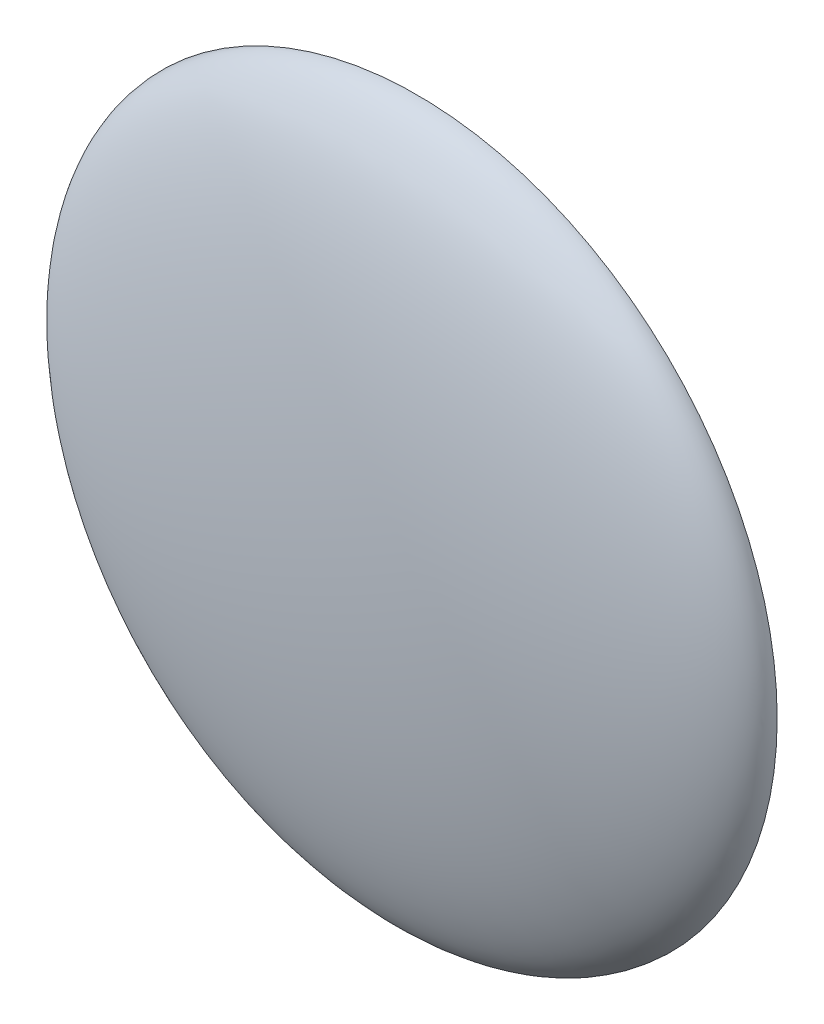
ISO-10303-21;
HEADER;
FILE_DESCRIPTION(('STEP AP214'),'2;1');
FILE_NAME('part.step','',(''),(''),'','','');
FILE_SCHEMA(('AUTOMOTIVE_DESIGN { 1 0 10303 214 1 1 1 1 }'));
ENDSEC;
DATA;
#1=APPLICATION_CONTEXT('core data for automotive mechanical design processes');
#2=APPLICATION_PROTOCOL_DEFINITION('international standard','automotive_design',2000,#1);
#3=PRODUCT_CONTEXT('',#1,'mechanical');
#4=PRODUCT('Part','Part','',(#3));
#5=PRODUCT_RELATED_PRODUCT_CATEGORY('part','',(#4));
#6=PRODUCT_DEFINITION_FORMATION('','',#4);
#7=PRODUCT_DEFINITION_CONTEXT('part definition',#1,'design');
#8=PRODUCT_DEFINITION('design','',#6,#7);
#9=PRODUCT_DEFINITION_SHAPE('','',#8);
#10=(LENGTH_UNIT() NAMED_UNIT(*) SI_UNIT(.MILLI.,.METRE.));
#11=(NAMED_UNIT(*) PLANE_ANGLE_UNIT() SI_UNIT($,.RADIAN.));
#12=(NAMED_UNIT(*) SI_UNIT($,.STERADIAN.) SOLID_ANGLE_UNIT());
#13=UNCERTAINTY_MEASURE_WITH_UNIT(LENGTH_MEASURE(1.E-05),#10,'distance_accuracy_value','');
#14=(GEOMETRIC_REPRESENTATION_CONTEXT(3) GLOBAL_UNCERTAINTY_ASSIGNED_CONTEXT((#13)) GLOBAL_UNIT_ASSIGNED_CONTEXT((#10,
#11,#12)) REPRESENTATION_CONTEXT('',''));
#15=CARTESIAN_POINT('',(0.,0.,0.));
#16=DIRECTION('',(0.,0.,1.));
#17=DIRECTION('',(1.,0.,0.));
#18=AXIS2_PLACEMENT_3D('',#15,#16,#17);
#19=CARTESIAN_POINT('',(0.,0.,-130.));
#20=DIRECTION('',(0.,1.,0.));
#21=DIRECTION('',(-1.,0.,0.));
#22=AXIS2_PLACEMENT_3D('',#19,#20,#21);
#23=ELLIPSE('',#22,540.,130.);
#24=TRIMMED_CURVE('',#23,(PARAMETER_VALUE(-1.5707963267949)),(PARAMETER_VALUE(1.5707963267949)),
.T.,.PARAMETER.);
#25=CARTESIAN_POINT('',(0.,0.,0.));
#26=DIRECTION('',(0.,0.,1.));
#27=AXIS1_PLACEMENT('',#25,#26);
#28=SURFACE_OF_REVOLUTION('',#24,#27);
#29=CARTESIAN_POINT('',(0.,0.,0.));
#30=VERTEX_POINT('',#29);
#31=VERTEX_LOOP('',#30);
#32=FACE_BOUND('',#31,.T.);
#33=CARTESIAN_POINT('',(0.,0.,-130.));
#34=DIRECTION('',(0.,0.,1.));
#35=DIRECTION('',(1.,0.,0.));
#36=AXIS2_PLACEMENT_3D('',#33,#34,#35);
#37=CIRCLE('',#36,540.);
#38=CARTESIAN_POINT('',(540.,0.,-130.));
#39=VERTEX_POINT('',#38);
#40=EDGE_CURVE('E11',#39,#39,#37,.T.);
#41=ORIENTED_EDGE('',*,*,#40,.T.);
#42=EDGE_LOOP('',(#41));
#43=FACE_BOUND('',#42,.T.);
#44=ADVANCED_FACE('F39',(#32,#43),#28,.T.);
#45=CARTESIAN_POINT('',(0.,0.,-130.));
#46=DIRECTION('',(0.,0.,1.));
#47=DIRECTION('',(1.,0.,0.));
#48=AXIS2_PLACEMENT_3D('',#45,#46,#47);
#49=PLANE('',#48);
#50=ORIENTED_EDGE('',*,*,#40,.F.);
#51=EDGE_LOOP('',(#50));
#52=FACE_BOUND('',#51,.T.);
#53=ADVANCED_FACE('F49',(#52),#49,.F.);
#54=CLOSED_SHELL('',(#44,#53));
#55=MANIFOLD_SOLID_BREP('B2',#54);
#56=ADVANCED_BREP_SHAPE_REPRESENTATION('',(#18,#55),#14);
#57=SHAPE_DEFINITION_REPRESENTATION(#9,#56);
ENDSEC;
END-ISO-10303-21;
